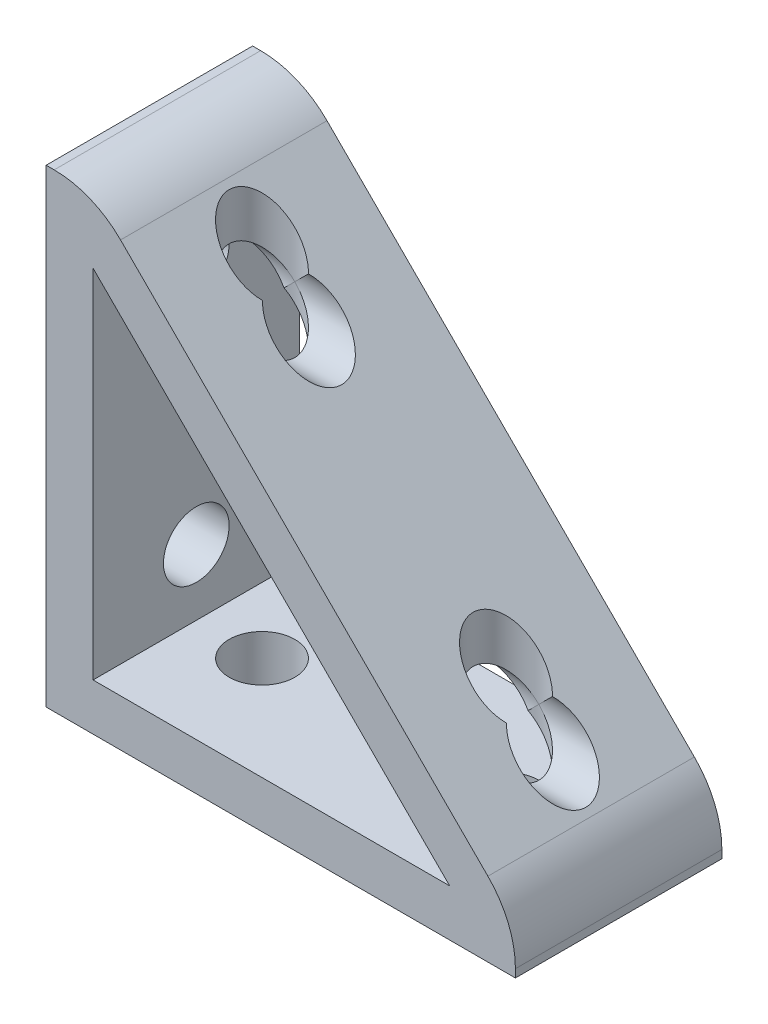
ISO-10303-21;
HEADER;
FILE_DESCRIPTION(('STEP AP214'),'2;1');
FILE_NAME('part.step','',(''),(''),'','','');
FILE_SCHEMA(('AUTOMOTIVE_DESIGN { 1 0 10303 214 1 1 1 1 }'));
ENDSEC;
DATA;
#1=APPLICATION_CONTEXT('core data for automotive mechanical design processes');
#2=APPLICATION_PROTOCOL_DEFINITION('international standard','automotive_design',2000,#1);
#3=PRODUCT_CONTEXT('',#1,'mechanical');
#4=PRODUCT('Part','Part','',(#3));
#5=PRODUCT_RELATED_PRODUCT_CATEGORY('part','',(#4));
#6=PRODUCT_DEFINITION_FORMATION('','',#4);
#7=PRODUCT_DEFINITION_CONTEXT('part definition',#1,'design');
#8=PRODUCT_DEFINITION('design','',#6,#7);
#9=PRODUCT_DEFINITION_SHAPE('','',#8);
#10=(LENGTH_UNIT() NAMED_UNIT(*) SI_UNIT(.MILLI.,.METRE.));
#11=(NAMED_UNIT(*) PLANE_ANGLE_UNIT() SI_UNIT($,.RADIAN.));
#12=(NAMED_UNIT(*) SI_UNIT($,.STERADIAN.) SOLID_ANGLE_UNIT());
#13=UNCERTAINTY_MEASURE_WITH_UNIT(LENGTH_MEASURE(1.E-05),#10,'distance_accuracy_value','');
#14=(GEOMETRIC_REPRESENTATION_CONTEXT(3) GLOBAL_UNCERTAINTY_ASSIGNED_CONTEXT((#13)) GLOBAL_UNIT_ASSIGNED_CONTEXT((#10,
#11,#12)) REPRESENTATION_CONTEXT('',''));
#15=CARTESIAN_POINT('',(0.,0.,0.));
#16=DIRECTION('',(0.,0.,1.));
#17=DIRECTION('',(1.,0.,0.));
#18=AXIS2_PLACEMENT_3D('',#15,#16,#17);
#19=CARTESIAN_POINT('',(50.,12.,0.));
#20=DIRECTION('',(-1.,0.,0.));
#21=DIRECTION('',(0.,-1.,0.));
#22=AXIS2_PLACEMENT_3D('',#19,#20,#21);
#23=CYLINDRICAL_SURFACE('',#22,3.5);
#24=CARTESIAN_POINT('',(38.,12.,0.));
#25=DIRECTION('',(-0.707106781186548,0.707106781186547,0.));
#26=DIRECTION('',(-0.707106781186547,-0.707106781186548,0.));
#27=AXIS2_PLACEMENT_3D('',#24,#25,#26);
#28=ELLIPSE('',#27,4.94974746830583,3.5);
#29=CARTESIAN_POINT('',(37.,11.,-3.35410196624968));
#30=VERTEX_POINT('',#29);
#31=CARTESIAN_POINT('',(38.,12.,-3.5));
#32=VERTEX_POINT('',#31);
#33=EDGE_CURVE('E71',#30,#32,#28,.F.);
#34=ORIENTED_EDGE('',*,*,#33,.T.);
#35=CARTESIAN_POINT('',(38.,12.,0.));
#36=DIRECTION('',(-0.707106781186547,-0.707106781186548,0.));
#37=DIRECTION('',(-0.707106781186548,0.707106781186547,0.));
#38=AXIS2_PLACEMENT_3D('',#35,#36,#37);
#39=ELLIPSE('',#38,4.94974746830583,3.5);
#40=CARTESIAN_POINT('',(38.,12.,3.5));
#41=VERTEX_POINT('',#40);
#42=EDGE_CURVE('E12',#32,#41,#39,.F.);
#43=ORIENTED_EDGE('',*,*,#42,.T.);
#44=CARTESIAN_POINT('',(37.,11.,3.35410196624968));
#45=VERTEX_POINT('',#44);
#46=EDGE_CURVE('E179',#41,#45,#28,.F.);
#47=ORIENTED_EDGE('',*,*,#46,.T.);
#48=CARTESIAN_POINT('',(36.,12.,0.));
#49=DIRECTION('',(0.707106781186548,0.707106781186548,0.));
#50=DIRECTION('',(-0.707106781186548,0.707106781186548,0.));
#51=AXIS2_PLACEMENT_3D('',#48,#49,#50);
#52=ELLIPSE('',#51,4.94974746830583,3.5);
#53=EDGE_CURVE('E184',#30,#45,#52,.T.);
#54=ORIENTED_EDGE('',*,*,#53,.F.);
#55=EDGE_LOOP('',(#34,#43,#47,#54));
#56=FACE_BOUND('',#55,.T.);
#57=ADVANCED_FACE('F57',(#56),#23,.F.);
#58=CARTESIAN_POINT('',(50.,38.,0.));
#59=DIRECTION('',(-1.,0.,0.));
#60=DIRECTION('',(0.,-1.,0.));
#61=AXIS2_PLACEMENT_3D('',#58,#59,#60);
#62=CYLINDRICAL_SURFACE('',#61,3.5);
#63=CARTESIAN_POINT('',(12.,38.,0.));
#64=DIRECTION('',(-0.707106781186548,0.707106781186547,0.));
#65=DIRECTION('',(-0.707106781186547,-0.707106781186548,0.));
#66=AXIS2_PLACEMENT_3D('',#63,#64,#65);
#67=ELLIPSE('',#66,4.94974746830583,3.5);
#68=CARTESIAN_POINT('',(11.,37.,-3.35410196624968));
#69=VERTEX_POINT('',#68);
#70=CARTESIAN_POINT('',(12.,38.,-3.5));
#71=VERTEX_POINT('',#70);
#72=EDGE_CURVE('E79',#69,#71,#67,.F.);
#73=ORIENTED_EDGE('',*,*,#72,.T.);
#74=CARTESIAN_POINT('',(12.,38.,0.));
#75=DIRECTION('',(-0.707106781186547,-0.707106781186548,0.));
#76=DIRECTION('',(-0.707106781186548,0.707106781186547,0.));
#77=AXIS2_PLACEMENT_3D('',#74,#75,#76);
#78=ELLIPSE('',#77,4.94974746830583,3.5);
#79=CARTESIAN_POINT('',(12.,38.,3.5));
#80=VERTEX_POINT('',#79);
#81=EDGE_CURVE('E177',#71,#80,#78,.F.);
#82=ORIENTED_EDGE('',*,*,#81,.T.);
#83=CARTESIAN_POINT('',(11.,37.,3.35410196624968));
#84=VERTEX_POINT('',#83);
#85=EDGE_CURVE('E288',#80,#84,#67,.F.);
#86=ORIENTED_EDGE('',*,*,#85,.T.);
#87=CARTESIAN_POINT('',(9.99999999999999,38.,0.));
#88=DIRECTION('',(0.707106781186548,0.707106781186548,0.));
#89=DIRECTION('',(-0.707106781186548,0.707106781186548,0.));
#90=AXIS2_PLACEMENT_3D('',#87,#88,#89);
#91=ELLIPSE('',#90,4.94974746830583,3.5);
#92=EDGE_CURVE('E203',#69,#84,#91,.T.);
#93=ORIENTED_EDGE('',*,*,#92,.F.);
#94=EDGE_LOOP('',(#73,#82,#86,#93));
#95=FACE_BOUND('',#94,.T.);
#96=ADVANCED_FACE('F371',(#95),#62,.F.);
#97=CARTESIAN_POINT('',(5.,50.,11.));
#98=DIRECTION('',(0.,-1.,0.));
#99=DIRECTION('',(0.,0.,-1.));
#100=AXIS2_PLACEMENT_3D('',#97,#98,#99);
#101=PLANE('',#100);
#102=DIRECTION('',(-1.,0.,0.));
#103=VECTOR('',#102,1.);
#104=CARTESIAN_POINT('',(5.,50.,11.));
#105=LINE('',#104,#103);
#106=CARTESIAN_POINT('',(0.857864376269053,50.,11.));
#107=VERTEX_POINT('',#106);
#108=CARTESIAN_POINT('',(0.,50.,11.));
#109=VERTEX_POINT('',#108);
#110=EDGE_CURVE('E234',#107,#109,#105,.T.);
#111=ORIENTED_EDGE('',*,*,#110,.F.);
#112=DIRECTION('',(0.,0.,-1.));
#113=VECTOR('',#112,1.);
#114=CARTESIAN_POINT('',(0.857864376269053,50.,11.));
#115=LINE('',#114,#113);
#116=CARTESIAN_POINT('',(0.857864376269053,50.,-11.));
#117=VERTEX_POINT('',#116);
#118=EDGE_CURVE('E264',#107,#117,#115,.T.);
#119=ORIENTED_EDGE('',*,*,#118,.T.);
#120=DIRECTION('',(-1.,0.,0.));
#121=VECTOR('',#120,1.);
#122=CARTESIAN_POINT('',(5.,50.,-11.));
#123=LINE('',#122,#121);
#124=CARTESIAN_POINT('',(0.,50.,-11.));
#125=VERTEX_POINT('',#124);
#126=EDGE_CURVE('E229',#117,#125,#123,.T.);
#127=ORIENTED_EDGE('',*,*,#126,.T.);
#128=DIRECTION('',(0.,0.,-1.));
#129=VECTOR('',#128,1.);
#130=CARTESIAN_POINT('',(0.,50.,11.));
#131=LINE('',#130,#129);
#132=EDGE_CURVE('E261',#109,#125,#131,.T.);
#133=ORIENTED_EDGE('',*,*,#132,.F.);
#134=EDGE_LOOP('',(#111,#119,#127,#133));
#135=FACE_BOUND('',#134,.T.);
#136=ADVANCED_FACE('F335',(#135),#101,.F.);
#137=CARTESIAN_POINT('',(0.,50.,11.));
#138=DIRECTION('',(1.,0.,0.));
#139=DIRECTION('',(0.,1.,0.));
#140=AXIS2_PLACEMENT_3D('',#137,#138,#139);
#141=PLANE('',#140);
#142=CARTESIAN_POINT('',(0.,12.,0.));
#143=DIRECTION('',(-1.,0.,0.));
#144=DIRECTION('',(0.,-1.,0.));
#145=AXIS2_PLACEMENT_3D('',#142,#143,#144);
#146=CIRCLE('',#145,3.5);
#147=CARTESIAN_POINT('',(0.,8.5,0.));
#148=VERTEX_POINT('',#147);
#149=EDGE_CURVE('E195',#148,#148,#146,.T.);
#150=ORIENTED_EDGE('',*,*,#149,.F.);
#151=EDGE_LOOP('',(#150));
#152=FACE_BOUND('',#151,.T.);
#153=CARTESIAN_POINT('',(0.,38.,0.));
#154=DIRECTION('',(-1.,0.,0.));
#155=DIRECTION('',(0.,-1.,0.));
#156=AXIS2_PLACEMENT_3D('',#153,#154,#155);
#157=CIRCLE('',#156,3.5);
#158=CARTESIAN_POINT('',(0.,34.5,0.));
#159=VERTEX_POINT('',#158);
#160=EDGE_CURVE('E192',#159,#159,#157,.T.);
#161=ORIENTED_EDGE('',*,*,#160,.F.);
#162=EDGE_LOOP('',(#161));
#163=FACE_BOUND('',#162,.T.);
#164=DIRECTION('',(0.,-1.,0.));
#165=VECTOR('',#164,1.);
#166=CARTESIAN_POINT('',(0.,50.,-11.));
#167=LINE('',#166,#165);
#168=CARTESIAN_POINT('',(0.,0.,-11.));
#169=VERTEX_POINT('',#168);
#170=EDGE_CURVE('E248',#125,#169,#167,.T.);
#171=ORIENTED_EDGE('',*,*,#170,.T.);
#172=DIRECTION('',(0.,0.,-1.));
#173=VECTOR('',#172,1.);
#174=CARTESIAN_POINT('',(0.,0.,11.));
#175=LINE('',#174,#173);
#176=CARTESIAN_POINT('',(0.,0.,11.));
#177=VERTEX_POINT('',#176);
#178=EDGE_CURVE('E258',#177,#169,#175,.T.);
#179=ORIENTED_EDGE('',*,*,#178,.F.);
#180=DIRECTION('',(0.,-1.,0.));
#181=VECTOR('',#180,1.);
#182=CARTESIAN_POINT('',(0.,50.,11.));
#183=LINE('',#182,#181);
#184=EDGE_CURVE('E236',#109,#177,#183,.T.);
#185=ORIENTED_EDGE('',*,*,#184,.F.);
#186=ORIENTED_EDGE('',*,*,#132,.T.);
#187=EDGE_LOOP('',(#171,#179,#185,#186));
#188=FACE_BOUND('',#187,.T.);
#189=ADVANCED_FACE('F331',(#152,#163,#188),#141,.F.);
#190=CARTESIAN_POINT('',(0.,0.,11.));
#191=DIRECTION('',(0.,1.,0.));
#192=DIRECTION('',(0.,0.,1.));
#193=AXIS2_PLACEMENT_3D('',#190,#191,#192);
#194=PLANE('',#193);
#195=CARTESIAN_POINT('',(38.,0.,0.));
#196=DIRECTION('',(0.,-1.,0.));
#197=DIRECTION('',(0.,0.,-1.));
#198=AXIS2_PLACEMENT_3D('',#195,#196,#197);
#199=CIRCLE('',#198,3.5);
#200=CARTESIAN_POINT('',(38.,0.,-3.5));
#201=VERTEX_POINT('',#200);
#202=EDGE_CURVE('E186',#201,#201,#199,.T.);
#203=ORIENTED_EDGE('',*,*,#202,.F.);
#204=EDGE_LOOP('',(#203));
#205=FACE_BOUND('',#204,.T.);
#206=CARTESIAN_POINT('',(12.,0.,0.));
#207=DIRECTION('',(0.,-1.,0.));
#208=DIRECTION('',(0.,0.,-1.));
#209=AXIS2_PLACEMENT_3D('',#206,#207,#208);
#210=CIRCLE('',#209,3.5);
#211=CARTESIAN_POINT('',(12.,0.,-3.5));
#212=VERTEX_POINT('',#211);
#213=EDGE_CURVE('E310',#212,#212,#210,.T.);
#214=ORIENTED_EDGE('',*,*,#213,.F.);
#215=EDGE_LOOP('',(#214));
#216=FACE_BOUND('',#215,.T.);
#217=DIRECTION('',(1.,0.,0.));
#218=VECTOR('',#217,1.);
#219=CARTESIAN_POINT('',(0.,0.,-11.));
#220=LINE('',#219,#218);
#221=CARTESIAN_POINT('',(50.,0.,-11.));
#222=VERTEX_POINT('',#221);
#223=EDGE_CURVE('E250',#169,#222,#220,.T.);
#224=ORIENTED_EDGE('',*,*,#223,.T.);
#225=DIRECTION('',(0.,0.,-1.));
#226=VECTOR('',#225,1.);
#227=CARTESIAN_POINT('',(50.,0.,11.));
#228=LINE('',#227,#226);
#229=CARTESIAN_POINT('',(50.,0.,11.));
#230=VERTEX_POINT('',#229);
#231=EDGE_CURVE('E246',#230,#222,#228,.T.);
#232=ORIENTED_EDGE('',*,*,#231,.F.);
#233=DIRECTION('',(1.,0.,0.));
#234=VECTOR('',#233,1.);
#235=CARTESIAN_POINT('',(0.,0.,11.));
#236=LINE('',#235,#234);
#237=EDGE_CURVE('E239',#177,#230,#236,.T.);
#238=ORIENTED_EDGE('',*,*,#237,.F.);
#239=ORIENTED_EDGE('',*,*,#178,.T.);
#240=EDGE_LOOP('',(#224,#232,#238,#239));
#241=FACE_BOUND('',#240,.T.);
#242=ADVANCED_FACE('F334',(#205,#216,#241),#194,.F.);
#243=CARTESIAN_POINT('',(50.,0.,11.));
#244=DIRECTION('',(-1.,0.,0.));
#245=DIRECTION('',(0.,0.,1.));
#246=AXIS2_PLACEMENT_3D('',#243,#244,#245);
#247=PLANE('',#246);
#248=DIRECTION('',(0.,1.,0.));
#249=VECTOR('',#248,1.);
#250=CARTESIAN_POINT('',(50.,0.,-11.));
#251=LINE('',#250,#249);
#252=CARTESIAN_POINT('',(50.,0.857864376269048,-11.));
#253=VERTEX_POINT('',#252);
#254=EDGE_CURVE('E252',#222,#253,#251,.T.);
#255=ORIENTED_EDGE('',*,*,#254,.T.);
#256=DIRECTION('',(0.,0.,-1.));
#257=VECTOR('',#256,1.);
#258=CARTESIAN_POINT('',(50.,0.857864376269048,11.));
#259=LINE('',#258,#257);
#260=CARTESIAN_POINT('',(50.,0.857864376269048,11.));
#261=VERTEX_POINT('',#260);
#262=EDGE_CURVE('E280',#253,#261,#259,.F.);
#263=ORIENTED_EDGE('',*,*,#262,.T.);
#264=DIRECTION('',(0.,1.,0.));
#265=VECTOR('',#264,1.);
#266=CARTESIAN_POINT('',(50.,0.,11.));
#267=LINE('',#266,#265);
#268=EDGE_CURVE('E241',#230,#261,#267,.T.);
#269=ORIENTED_EDGE('',*,*,#268,.F.);
#270=ORIENTED_EDGE('',*,*,#231,.T.);
#271=EDGE_LOOP('',(#255,#263,#269,#270));
#272=FACE_BOUND('',#271,.T.);
#273=ADVANCED_FACE('F354',(#272),#247,.F.);
#274=CARTESIAN_POINT('',(50.,5.,11.));
#275=DIRECTION('',(-0.707106781186548,-0.707106781186548,0.));
#276=DIRECTION('',(0.707106781186548,-0.707106781186548,0.));
#277=AXIS2_PLACEMENT_3D('',#274,#275,#276);
#278=PLANE('',#277);
#279=CARTESIAN_POINT('',(43.,12.,0.));
#280=DIRECTION('',(-0.707106781186548,-0.707106781186548,0.));
#281=DIRECTION('',(-0.707106781186548,0.707106781186548,0.));
#282=AXIS2_PLACEMENT_3D('',#279,#280,#281);
#283=ELLIPSE('',#282,4.94974746830583,3.5);
#284=CARTESIAN_POINT('',(40.5,14.5,-2.44948974278318));
#285=VERTEX_POINT('',#284);
#286=CARTESIAN_POINT('',(40.5,14.5,2.44948974278318));
#287=VERTEX_POINT('',#286);
#288=EDGE_CURVE('E188',#285,#287,#283,.T.);
#289=ORIENTED_EDGE('',*,*,#288,.T.);
#290=CARTESIAN_POINT('',(38.,17.,0.));
#291=DIRECTION('',(-0.707106781186548,-0.707106781186548,0.));
#292=DIRECTION('',(0.707106781186548,-0.707106781186548,0.));
#293=AXIS2_PLACEMENT_3D('',#290,#291,#292);
#294=ELLIPSE('',#293,4.94974746830583,3.5);
#295=EDGE_CURVE('E185',#287,#285,#294,.T.);
#296=ORIENTED_EDGE('',*,*,#295,.T.);
#297=EDGE_LOOP('',(#289,#296));
#298=FACE_BOUND('',#297,.T.);
#299=CARTESIAN_POINT('',(17.,38.,0.));
#300=DIRECTION('',(-0.707106781186548,-0.707106781186548,0.));
#301=DIRECTION('',(-0.707106781186548,0.707106781186548,0.));
#302=AXIS2_PLACEMENT_3D('',#299,#300,#301);
#303=ELLIPSE('',#302,4.94974746830583,3.5);
#304=CARTESIAN_POINT('',(14.5,40.5,-2.44948974278318));
#305=VERTEX_POINT('',#304);
#306=CARTESIAN_POINT('',(14.5,40.5,2.44948974278318));
#307=VERTEX_POINT('',#306);
#308=EDGE_CURVE('E206',#305,#307,#303,.T.);
#309=ORIENTED_EDGE('',*,*,#308,.T.);
#310=CARTESIAN_POINT('',(12.,43.,0.));
#311=DIRECTION('',(-0.707106781186548,-0.707106781186548,0.));
#312=DIRECTION('',(0.707106781186548,-0.707106781186548,0.));
#313=AXIS2_PLACEMENT_3D('',#310,#311,#312);
#314=ELLIPSE('',#313,4.94974746830583,3.5);
#315=EDGE_CURVE('E319',#307,#305,#314,.T.);
#316=ORIENTED_EDGE('',*,*,#315,.T.);
#317=EDGE_LOOP('',(#309,#316));
#318=FACE_BOUND('',#317,.T.);
#319=DIRECTION('',(-0.707106781186548,0.707106781186548,0.));
#320=VECTOR('',#319,1.);
#321=CARTESIAN_POINT('',(50.,5.,11.));
#322=LINE('',#321,#320);
#323=CARTESIAN_POINT('',(47.0710678118655,7.92893218813453,11.));
#324=VERTEX_POINT('',#323);
#325=CARTESIAN_POINT('',(7.92893218813451,47.0710678118655,11.));
#326=VERTEX_POINT('',#325);
#327=EDGE_CURVE('E244',#324,#326,#322,.T.);
#328=ORIENTED_EDGE('',*,*,#327,.F.);
#329=DIRECTION('',(0.,0.,-1.));
#330=VECTOR('',#329,1.);
#331=CARTESIAN_POINT('',(47.0710678118655,7.92893218813453,11.));
#332=LINE('',#331,#330);
#333=CARTESIAN_POINT('',(47.0710678118655,7.92893218813453,-11.));
#334=VERTEX_POINT('',#333);
#335=EDGE_CURVE('E275',#324,#334,#332,.T.);
#336=ORIENTED_EDGE('',*,*,#335,.T.);
#337=DIRECTION('',(-0.707106781186548,0.707106781186548,0.));
#338=VECTOR('',#337,1.);
#339=CARTESIAN_POINT('',(50.,5.,-11.));
#340=LINE('',#339,#338);
#341=CARTESIAN_POINT('',(7.92893218813451,47.0710678118655,-11.));
#342=VERTEX_POINT('',#341);
#343=EDGE_CURVE('E237',#334,#342,#340,.T.);
#344=ORIENTED_EDGE('',*,*,#343,.T.);
#345=DIRECTION('',(0.,0.,-1.));
#346=VECTOR('',#345,1.);
#347=CARTESIAN_POINT('',(7.92893218813453,47.0710678118655,11.));
#348=LINE('',#347,#346);
#349=EDGE_CURVE('E270',#342,#326,#348,.F.);
#350=ORIENTED_EDGE('',*,*,#349,.T.);
#351=EDGE_LOOP('',(#328,#336,#344,#350));
#352=FACE_BOUND('',#351,.T.);
#353=ADVANCED_FACE('F305',(#298,#318,#352),#278,.F.);
#354=CARTESIAN_POINT('',(0.,0.,11.));
#355=DIRECTION('',(0.,0.,1.));
#356=DIRECTION('',(1.,0.,0.));
#357=AXIS2_PLACEMENT_3D('',#354,#355,#356);
#358=PLANE('',#357);
#359=DIRECTION('',(-1.,0.,0.));
#360=VECTOR('',#359,1.);
#361=CARTESIAN_POINT('',(43.,5.,11.));
#362=LINE('',#361,#360);
#363=CARTESIAN_POINT('',(43.,5.,11.));
#364=VERTEX_POINT('',#363);
#365=CARTESIAN_POINT('',(5.,5.,11.));
#366=VERTEX_POINT('',#365);
#367=EDGE_CURVE('E210',#364,#366,#362,.T.);
#368=ORIENTED_EDGE('',*,*,#367,.T.);
#369=DIRECTION('',(0.,1.,0.));
#370=VECTOR('',#369,1.);
#371=CARTESIAN_POINT('',(5.,5.,11.));
#372=LINE('',#371,#370);
#373=CARTESIAN_POINT('',(5.,43.,11.));
#374=VERTEX_POINT('',#373);
#375=EDGE_CURVE('E213',#366,#374,#372,.T.);
#376=ORIENTED_EDGE('',*,*,#375,.T.);
#377=DIRECTION('',(0.707106781186547,-0.707106781186547,0.));
#378=VECTOR('',#377,1.);
#379=CARTESIAN_POINT('',(5.,43.,11.));
#380=LINE('',#379,#378);
#381=EDGE_CURVE('E217',#374,#364,#380,.T.);
#382=ORIENTED_EDGE('',*,*,#381,.T.);
#383=EDGE_LOOP('',(#368,#376,#382));
#384=FACE_BOUND('',#383,.T.);
#385=ORIENTED_EDGE('',*,*,#268,.T.);
#386=CARTESIAN_POINT('',(40.,0.857864376269048,11.));
#387=DIRECTION('',(0.,0.,1.));
#388=DIRECTION('',(1.,0.,0.));
#389=AXIS2_PLACEMENT_3D('',#386,#387,#388);
#390=CIRCLE('',#389,10.);
#391=EDGE_CURVE('E282',#261,#324,#390,.T.);
#392=ORIENTED_EDGE('',*,*,#391,.T.);
#393=ORIENTED_EDGE('',*,*,#327,.T.);
#394=CARTESIAN_POINT('',(0.857864376269053,40.,11.));
#395=DIRECTION('',(0.,0.,1.));
#396=DIRECTION('',(1.,0.,0.));
#397=AXIS2_PLACEMENT_3D('',#394,#395,#396);
#398=CIRCLE('',#397,10.);
#399=EDGE_CURVE('E273',#326,#107,#398,.T.);
#400=ORIENTED_EDGE('',*,*,#399,.T.);
#401=ORIENTED_EDGE('',*,*,#110,.T.);
#402=ORIENTED_EDGE('',*,*,#184,.T.);
#403=ORIENTED_EDGE('',*,*,#237,.T.);
#404=EDGE_LOOP('',(#385,#392,#393,#400,#401,#402,#403));
#405=FACE_BOUND('',#404,.T.);
#406=ADVANCED_FACE('F361',(#384,#405),#358,.T.);
#407=CARTESIAN_POINT('',(0.,0.,-11.));
#408=DIRECTION('',(0.,0.,1.));
#409=DIRECTION('',(1.,0.,0.));
#410=AXIS2_PLACEMENT_3D('',#407,#408,#409);
#411=PLANE('',#410);
#412=DIRECTION('',(0.,1.,0.));
#413=VECTOR('',#412,1.);
#414=CARTESIAN_POINT('',(5.,5.,-11.));
#415=LINE('',#414,#413);
#416=CARTESIAN_POINT('',(5.,5.,-11.));
#417=VERTEX_POINT('',#416);
#418=CARTESIAN_POINT('',(5.,43.,-11.));
#419=VERTEX_POINT('',#418);
#420=EDGE_CURVE('E222',#417,#419,#415,.T.);
#421=ORIENTED_EDGE('',*,*,#420,.F.);
#422=DIRECTION('',(-1.,0.,0.));
#423=VECTOR('',#422,1.);
#424=CARTESIAN_POINT('',(43.,5.,-11.));
#425=LINE('',#424,#423);
#426=CARTESIAN_POINT('',(43.,5.,-11.));
#427=VERTEX_POINT('',#426);
#428=EDGE_CURVE('E209',#427,#417,#425,.T.);
#429=ORIENTED_EDGE('',*,*,#428,.F.);
#430=DIRECTION('',(0.707106781186547,-0.707106781186547,0.));
#431=VECTOR('',#430,1.);
#432=CARTESIAN_POINT('',(5.,43.,-11.));
#433=LINE('',#432,#431);
#434=EDGE_CURVE('E214',#419,#427,#433,.T.);
#435=ORIENTED_EDGE('',*,*,#434,.F.);
#436=EDGE_LOOP('',(#421,#429,#435));
#437=FACE_BOUND('',#436,.T.);
#438=ORIENTED_EDGE('',*,*,#343,.F.);
#439=CARTESIAN_POINT('',(40.,0.857864376269048,-11.));
#440=DIRECTION('',(0.,0.,1.));
#441=DIRECTION('',(1.,0.,0.));
#442=AXIS2_PLACEMENT_3D('',#439,#440,#441);
#443=CIRCLE('',#442,10.);
#444=EDGE_CURVE('E278',#334,#253,#443,.F.);
#445=ORIENTED_EDGE('',*,*,#444,.T.);
#446=ORIENTED_EDGE('',*,*,#254,.F.);
#447=ORIENTED_EDGE('',*,*,#223,.F.);
#448=ORIENTED_EDGE('',*,*,#170,.F.);
#449=ORIENTED_EDGE('',*,*,#126,.F.);
#450=CARTESIAN_POINT('',(0.857864376269053,40.,-11.));
#451=DIRECTION('',(0.,0.,1.));
#452=DIRECTION('',(1.,0.,0.));
#453=AXIS2_PLACEMENT_3D('',#450,#451,#452);
#454=CIRCLE('',#453,10.);
#455=EDGE_CURVE('E267',#117,#342,#454,.F.);
#456=ORIENTED_EDGE('',*,*,#455,.T.);
#457=EDGE_LOOP('',(#438,#445,#446,#447,#448,#449,#456));
#458=FACE_BOUND('',#457,.T.);
#459=ADVANCED_FACE('F351',(#437,#458),#411,.F.);
#460=CARTESIAN_POINT('',(43.,5.,11.));
#461=DIRECTION('',(0.,-1.,0.));
#462=DIRECTION('',(1.,0.,0.));
#463=AXIS2_PLACEMENT_3D('',#460,#461,#462);
#464=PLANE('',#463);
#465=CARTESIAN_POINT('',(38.,5.,0.));
#466=DIRECTION('',(0.,-1.,0.));
#467=DIRECTION('',(1.,0.,0.));
#468=AXIS2_PLACEMENT_3D('',#465,#466,#467);
#469=CIRCLE('',#468,3.5);
#470=CARTESIAN_POINT('',(41.5,5.,0.));
#471=VERTEX_POINT('',#470);
#472=EDGE_CURVE('E307',#471,#471,#469,.T.);
#473=ORIENTED_EDGE('',*,*,#472,.T.);
#474=EDGE_LOOP('',(#473));
#475=FACE_BOUND('',#474,.T.);
#476=CARTESIAN_POINT('',(12.,5.,0.));
#477=DIRECTION('',(0.,-1.,0.));
#478=DIRECTION('',(1.,0.,0.));
#479=AXIS2_PLACEMENT_3D('',#476,#477,#478);
#480=CIRCLE('',#479,3.5);
#481=CARTESIAN_POINT('',(15.5,5.,0.));
#482=VERTEX_POINT('',#481);
#483=EDGE_CURVE('E321',#482,#482,#480,.T.);
#484=ORIENTED_EDGE('',*,*,#483,.T.);
#485=EDGE_LOOP('',(#484));
#486=FACE_BOUND('',#485,.T.);
#487=ORIENTED_EDGE('',*,*,#428,.T.);
#488=DIRECTION('',(0.,0.,-1.));
#489=VECTOR('',#488,1.);
#490=CARTESIAN_POINT('',(5.,5.,11.));
#491=LINE('',#490,#489);
#492=EDGE_CURVE('E220',#366,#417,#491,.T.);
#493=ORIENTED_EDGE('',*,*,#492,.F.);
#494=ORIENTED_EDGE('',*,*,#367,.F.);
#495=DIRECTION('',(0.,0.,-1.));
#496=VECTOR('',#495,1.);
#497=CARTESIAN_POINT('',(43.,5.,11.));
#498=LINE('',#497,#496);
#499=EDGE_CURVE('E227',#364,#427,#498,.T.);
#500=ORIENTED_EDGE('',*,*,#499,.T.);
#501=EDGE_LOOP('',(#487,#493,#494,#500));
#502=FACE_BOUND('',#501,.T.);
#503=ADVANCED_FACE('F421',(#475,#486,#502),#464,.F.);
#504=CARTESIAN_POINT('',(5.,43.,11.));
#505=DIRECTION('',(0.707106781186548,0.707106781186548,0.));
#506=DIRECTION('',(-0.707106781186548,0.707106781186548,0.));
#507=AXIS2_PLACEMENT_3D('',#504,#505,#506);
#508=PLANE('',#507);
#509=ORIENTED_EDGE('',*,*,#53,.T.);
#510=CARTESIAN_POINT('',(38.,9.99999999999999,0.));
#511=DIRECTION('',(0.707106781186548,0.707106781186548,0.));
#512=DIRECTION('',(0.707106781186548,-0.707106781186548,0.));
#513=AXIS2_PLACEMENT_3D('',#510,#511,#512);
#514=ELLIPSE('',#513,4.94974746830583,3.5);
#515=EDGE_CURVE('E172',#45,#30,#514,.T.);
#516=ORIENTED_EDGE('',*,*,#515,.T.);
#517=EDGE_LOOP('',(#509,#516));
#518=FACE_BOUND('',#517,.T.);
#519=ORIENTED_EDGE('',*,*,#92,.T.);
#520=CARTESIAN_POINT('',(12.,36.,0.));
#521=DIRECTION('',(0.707106781186548,0.707106781186548,0.));
#522=DIRECTION('',(0.707106781186548,-0.707106781186548,0.));
#523=AXIS2_PLACEMENT_3D('',#520,#521,#522);
#524=ELLIPSE('',#523,4.94974746830583,3.5);
#525=EDGE_CURVE('E316',#84,#69,#524,.T.);
#526=ORIENTED_EDGE('',*,*,#525,.T.);
#527=EDGE_LOOP('',(#519,#526));
#528=FACE_BOUND('',#527,.T.);
#529=ORIENTED_EDGE('',*,*,#434,.T.);
#530=ORIENTED_EDGE('',*,*,#499,.F.);
#531=ORIENTED_EDGE('',*,*,#381,.F.);
#532=DIRECTION('',(0.,0.,-1.));
#533=VECTOR('',#532,1.);
#534=CARTESIAN_POINT('',(5.,43.,11.));
#535=LINE('',#534,#533);
#536=EDGE_CURVE('E230',#374,#419,#535,.T.);
#537=ORIENTED_EDGE('',*,*,#536,.T.);
#538=EDGE_LOOP('',(#529,#530,#531,#537));
#539=FACE_BOUND('',#538,.T.);
#540=ADVANCED_FACE('F182',(#518,#528,#539),#508,.F.);
#541=CARTESIAN_POINT('',(5.,5.,11.));
#542=DIRECTION('',(-1.,0.,0.));
#543=DIRECTION('',(0.,0.,1.));
#544=AXIS2_PLACEMENT_3D('',#541,#542,#543);
#545=PLANE('',#544);
#546=CARTESIAN_POINT('',(5.,12.,0.));
#547=DIRECTION('',(-1.,0.,0.));
#548=DIRECTION('',(0.,0.,1.));
#549=AXIS2_PLACEMENT_3D('',#546,#547,#548);
#550=CIRCLE('',#549,3.5);
#551=CARTESIAN_POINT('',(5.,12.,3.5));
#552=VERTEX_POINT('',#551);
#553=EDGE_CURVE('E189',#552,#552,#550,.T.);
#554=ORIENTED_EDGE('',*,*,#553,.T.);
#555=EDGE_LOOP('',(#554));
#556=FACE_BOUND('',#555,.T.);
#557=CARTESIAN_POINT('',(5.,38.,0.));
#558=DIRECTION('',(-1.,0.,0.));
#559=DIRECTION('',(0.,0.,1.));
#560=AXIS2_PLACEMENT_3D('',#557,#558,#559);
#561=CIRCLE('',#560,3.5);
#562=CARTESIAN_POINT('',(5.,38.,3.5));
#563=VERTEX_POINT('',#562);
#564=EDGE_CURVE('E202',#563,#563,#561,.T.);
#565=ORIENTED_EDGE('',*,*,#564,.T.);
#566=EDGE_LOOP('',(#565));
#567=FACE_BOUND('',#566,.T.);
#568=ORIENTED_EDGE('',*,*,#420,.T.);
#569=ORIENTED_EDGE('',*,*,#536,.F.);
#570=ORIENTED_EDGE('',*,*,#375,.F.);
#571=ORIENTED_EDGE('',*,*,#492,.T.);
#572=EDGE_LOOP('',(#568,#569,#570,#571));
#573=FACE_BOUND('',#572,.T.);
#574=ADVANCED_FACE('F429',(#556,#567,#573),#545,.F.);
#575=CARTESIAN_POINT('',(0.857864376269053,40.,11.));
#576=DIRECTION('',(0.,0.,-1.));
#577=DIRECTION('',(-1.,0.,0.));
#578=AXIS2_PLACEMENT_3D('',#575,#576,#577);
#579=CYLINDRICAL_SURFACE('',#578,10.);
#580=ORIENTED_EDGE('',*,*,#399,.F.);
#581=ORIENTED_EDGE('',*,*,#349,.F.);
#582=ORIENTED_EDGE('',*,*,#455,.F.);
#583=ORIENTED_EDGE('',*,*,#118,.F.);
#584=EDGE_LOOP('',(#580,#581,#582,#583));
#585=FACE_BOUND('',#584,.T.);
#586=ADVANCED_FACE('F367',(#585),#579,.T.);
#587=CARTESIAN_POINT('',(40.,0.857864376269048,11.));
#588=DIRECTION('',(0.,0.,-1.));
#589=DIRECTION('',(-1.,0.,0.));
#590=AXIS2_PLACEMENT_3D('',#587,#588,#589);
#591=CYLINDRICAL_SURFACE('',#590,10.);
#592=ORIENTED_EDGE('',*,*,#391,.F.);
#593=ORIENTED_EDGE('',*,*,#262,.F.);
#594=ORIENTED_EDGE('',*,*,#444,.F.);
#595=ORIENTED_EDGE('',*,*,#335,.F.);
#596=EDGE_LOOP('',(#592,#593,#594,#595));
#597=FACE_BOUND('',#596,.T.);
#598=ADVANCED_FACE('F59',(#597),#591,.T.);
#599=ORIENTED_EDGE('',*,*,#160,.T.);
#600=EDGE_LOOP('',(#599));
#601=FACE_BOUND('',#600,.T.);
#602=ORIENTED_EDGE('',*,*,#564,.F.);
#603=EDGE_LOOP('',(#602));
#604=FACE_BOUND('',#603,.T.);
#605=ADVANCED_FACE('F377',(#601,#604),#62,.F.);
#606=CARTESIAN_POINT('',(12.,38.,0.));
#607=DIRECTION('',(-0.707106781186548,0.707106781186547,0.));
#608=DIRECTION('',(-0.707106781186547,-0.707106781186548,0.));
#609=AXIS2_PLACEMENT_3D('',#606,#607,#608);
#610=ELLIPSE('',#609,4.94974746830583,3.5);
#611=EDGE_CURVE('E287',#305,#71,#610,.T.);
#612=ORIENTED_EDGE('',*,*,#611,.T.);
#613=CARTESIAN_POINT('',(12.,38.,0.));
#614=DIRECTION('',(-0.707106781186547,-0.707106781186548,0.));
#615=DIRECTION('',(-0.707106781186548,0.707106781186547,0.));
#616=AXIS2_PLACEMENT_3D('',#613,#614,#615);
#617=ELLIPSE('',#616,4.94974746830583,3.5);
#618=EDGE_CURVE('E292',#71,#80,#617,.T.);
#619=ORIENTED_EDGE('',*,*,#618,.T.);
#620=EDGE_CURVE('E291',#80,#307,#610,.T.);
#621=ORIENTED_EDGE('',*,*,#620,.T.);
#622=ORIENTED_EDGE('',*,*,#308,.F.);
#623=EDGE_LOOP('',(#612,#619,#621,#622));
#624=FACE_BOUND('',#623,.T.);
#625=ADVANCED_FACE('F378',(#624),#62,.F.);
#626=ORIENTED_EDGE('',*,*,#149,.T.);
#627=EDGE_LOOP('',(#626));
#628=FACE_BOUND('',#627,.T.);
#629=ORIENTED_EDGE('',*,*,#553,.F.);
#630=EDGE_LOOP('',(#629));
#631=FACE_BOUND('',#630,.T.);
#632=ADVANCED_FACE('F328',(#628,#631),#23,.F.);
#633=CARTESIAN_POINT('',(38.,12.,0.));
#634=DIRECTION('',(-0.707106781186548,0.707106781186547,0.));
#635=DIRECTION('',(-0.707106781186547,-0.707106781186548,0.));
#636=AXIS2_PLACEMENT_3D('',#633,#634,#635);
#637=ELLIPSE('',#636,4.94974746830583,3.5);
#638=EDGE_CURVE('E176',#285,#32,#637,.T.);
#639=ORIENTED_EDGE('',*,*,#638,.T.);
#640=CARTESIAN_POINT('',(38.,12.,0.));
#641=DIRECTION('',(-0.707106781186547,-0.707106781186548,0.));
#642=DIRECTION('',(-0.707106781186548,0.707106781186547,0.));
#643=AXIS2_PLACEMENT_3D('',#640,#641,#642);
#644=ELLIPSE('',#643,4.94974746830583,3.5);
#645=EDGE_CURVE('E65',#32,#41,#644,.T.);
#646=ORIENTED_EDGE('',*,*,#645,.T.);
#647=EDGE_CURVE('E297',#41,#287,#637,.T.);
#648=ORIENTED_EDGE('',*,*,#647,.T.);
#649=ORIENTED_EDGE('',*,*,#288,.F.);
#650=EDGE_LOOP('',(#639,#646,#648,#649));
#651=FACE_BOUND('',#650,.T.);
#652=ADVANCED_FACE('F301',(#651),#23,.F.);
#653=CARTESIAN_POINT('',(12.,50.,0.));
#654=DIRECTION('',(0.,-1.,0.));
#655=DIRECTION('',(0.,0.,-1.));
#656=AXIS2_PLACEMENT_3D('',#653,#654,#655);
#657=CYLINDRICAL_SURFACE('',#656,3.5);
#658=ORIENTED_EDGE('',*,*,#72,.F.);
#659=ORIENTED_EDGE('',*,*,#525,.F.);
#660=ORIENTED_EDGE('',*,*,#85,.F.);
#661=ORIENTED_EDGE('',*,*,#618,.F.);
#662=EDGE_LOOP('',(#658,#659,#660,#661));
#663=FACE_BOUND('',#662,.T.);
#664=ADVANCED_FACE('F386',(#663),#657,.F.);
#665=ORIENTED_EDGE('',*,*,#611,.F.);
#666=ORIENTED_EDGE('',*,*,#315,.F.);
#667=ORIENTED_EDGE('',*,*,#620,.F.);
#668=ORIENTED_EDGE('',*,*,#81,.F.);
#669=EDGE_LOOP('',(#665,#666,#667,#668));
#670=FACE_BOUND('',#669,.T.);
#671=ADVANCED_FACE('F390',(#670),#657,.F.);
#672=ORIENTED_EDGE('',*,*,#213,.T.);
#673=EDGE_LOOP('',(#672));
#674=FACE_BOUND('',#673,.T.);
#675=ORIENTED_EDGE('',*,*,#483,.F.);
#676=EDGE_LOOP('',(#675));
#677=FACE_BOUND('',#676,.T.);
#678=ADVANCED_FACE('F392',(#674,#677),#657,.F.);
#679=CARTESIAN_POINT('',(38.,50.,0.));
#680=DIRECTION('',(0.,-1.,0.));
#681=DIRECTION('',(0.,0.,-1.));
#682=AXIS2_PLACEMENT_3D('',#679,#680,#681);
#683=CYLINDRICAL_SURFACE('',#682,3.5);
#684=ORIENTED_EDGE('',*,*,#33,.F.);
#685=ORIENTED_EDGE('',*,*,#515,.F.);
#686=ORIENTED_EDGE('',*,*,#46,.F.);
#687=ORIENTED_EDGE('',*,*,#645,.F.);
#688=EDGE_LOOP('',(#684,#685,#686,#687));
#689=FACE_BOUND('',#688,.T.);
#690=ADVANCED_FACE('F170',(#689),#683,.F.);
#691=ORIENTED_EDGE('',*,*,#638,.F.);
#692=ORIENTED_EDGE('',*,*,#295,.F.);
#693=ORIENTED_EDGE('',*,*,#647,.F.);
#694=ORIENTED_EDGE('',*,*,#42,.F.);
#695=EDGE_LOOP('',(#691,#692,#693,#694));
#696=FACE_BOUND('',#695,.T.);
#697=ADVANCED_FACE('F403',(#696),#683,.F.);
#698=ORIENTED_EDGE('',*,*,#202,.T.);
#699=EDGE_LOOP('',(#698));
#700=FACE_BOUND('',#699,.T.);
#701=ORIENTED_EDGE('',*,*,#472,.F.);
#702=EDGE_LOOP('',(#701));
#703=FACE_BOUND('',#702,.T.);
#704=ADVANCED_FACE('F404',(#700,#703),#683,.F.);
#705=CLOSED_SHELL('',(#57,#96,#136,#189,#242,#273,#353,#406,#459,#503,#540,#574,#586,#598,#605,
#625,#632,#652,#664,#671,#678,#690,#697,#704));
#706=MANIFOLD_SOLID_BREP('B2',#705);
#707=ADVANCED_BREP_SHAPE_REPRESENTATION('',(#18,#706),#14);
#708=SHAPE_DEFINITION_REPRESENTATION(#9,#707);
ENDSEC;
END-ISO-10303-21;
